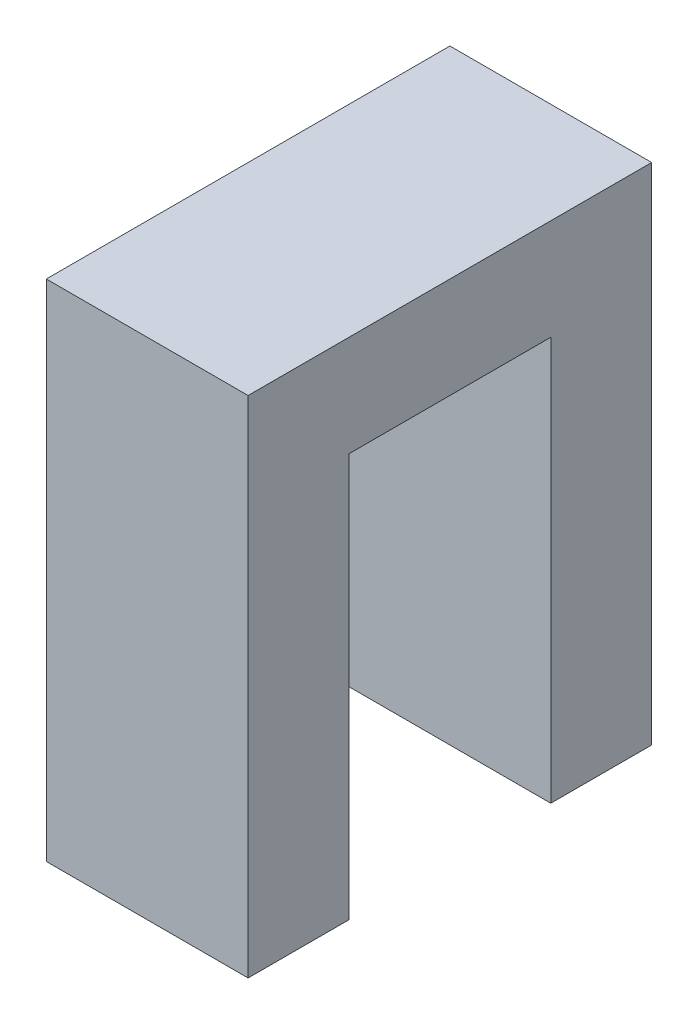
ISO-10303-21;
HEADER;
FILE_DESCRIPTION(('STEP AP214'),'2;1');
FILE_NAME('part.step','',(''),(''),'','','');
FILE_SCHEMA(('AUTOMOTIVE_DESIGN { 1 0 10303 214 1 1 1 1 }'));
ENDSEC;
DATA;
#1=APPLICATION_CONTEXT('core data for automotive mechanical design processes');
#2=APPLICATION_PROTOCOL_DEFINITION('international standard','automotive_design',2000,#1);
#3=PRODUCT_CONTEXT('',#1,'mechanical');
#4=PRODUCT('Part','Part','',(#3));
#5=PRODUCT_RELATED_PRODUCT_CATEGORY('part','',(#4));
#6=PRODUCT_DEFINITION_FORMATION('','',#4);
#7=PRODUCT_DEFINITION_CONTEXT('part definition',#1,'design');
#8=PRODUCT_DEFINITION('design','',#6,#7);
#9=PRODUCT_DEFINITION_SHAPE('','',#8);
#10=(LENGTH_UNIT() NAMED_UNIT(*) SI_UNIT(.MILLI.,.METRE.));
#11=(NAMED_UNIT(*) PLANE_ANGLE_UNIT() SI_UNIT($,.RADIAN.));
#12=(NAMED_UNIT(*) SI_UNIT($,.STERADIAN.) SOLID_ANGLE_UNIT());
#13=UNCERTAINTY_MEASURE_WITH_UNIT(LENGTH_MEASURE(1.E-05),#10,'distance_accuracy_value','');
#14=(GEOMETRIC_REPRESENTATION_CONTEXT(3) GLOBAL_UNCERTAINTY_ASSIGNED_CONTEXT((#13)) GLOBAL_UNIT_ASSIGNED_CONTEXT((#10,
#11,#12)) REPRESENTATION_CONTEXT('',''));
#15=CARTESIAN_POINT('',(0.,0.,0.));
#16=DIRECTION('',(0.,0.,1.));
#17=DIRECTION('',(1.,0.,0.));
#18=AXIS2_PLACEMENT_3D('',#15,#16,#17);
#19=CARTESIAN_POINT('',(-20.,-50.,40.));
#20=DIRECTION('',(0.,1.,0.));
#21=DIRECTION('',(0.,0.,1.));
#22=AXIS2_PLACEMENT_3D('',#19,#20,#21);
#23=PLANE('',#22);
#24=DIRECTION('',(0.,0.,-1.));
#25=VECTOR('',#24,1.);
#26=CARTESIAN_POINT('',(-20.,-50.,40.));
#27=LINE('',#26,#25);
#28=CARTESIAN_POINT('',(-20.,-50.,40.));
#29=VERTEX_POINT('',#28);
#30=CARTESIAN_POINT('',(-20.,-50.,20.));
#31=VERTEX_POINT('',#30);
#32=EDGE_CURVE('E125',#29,#31,#27,.T.);
#33=ORIENTED_EDGE('',*,*,#32,.T.);
#34=DIRECTION('',(1.,0.,0.));
#35=VECTOR('',#34,1.);
#36=CARTESIAN_POINT('',(-20.,-50.,20.));
#37=LINE('',#36,#35);
#38=CARTESIAN_POINT('',(20.,-50.,20.));
#39=VERTEX_POINT('',#38);
#40=EDGE_CURVE('E41',#31,#39,#37,.T.);
#41=ORIENTED_EDGE('',*,*,#40,.T.);
#42=DIRECTION('',(0.,0.,-1.));
#43=VECTOR('',#42,1.);
#44=CARTESIAN_POINT('',(20.,-50.,40.));
#45=LINE('',#44,#43);
#46=CARTESIAN_POINT('',(20.,-50.,40.));
#47=VERTEX_POINT('',#46);
#48=EDGE_CURVE('E122',#47,#39,#45,.T.);
#49=ORIENTED_EDGE('',*,*,#48,.F.);
#50=DIRECTION('',(1.,0.,0.));
#51=VECTOR('',#50,1.);
#52=CARTESIAN_POINT('',(-20.,-50.,40.));
#53=LINE('',#52,#51);
#54=EDGE_CURVE('E57',#29,#47,#53,.T.);
#55=ORIENTED_EDGE('',*,*,#54,.F.);
#56=EDGE_LOOP('',(#33,#41,#49,#55));
#57=FACE_BOUND('',#56,.T.);
#58=ADVANCED_FACE('F33',(#57),#23,.F.);
#59=CARTESIAN_POINT('',(20.,-50.,40.));
#60=DIRECTION('',(-1.,0.,0.));
#61=DIRECTION('',(0.,0.,1.));
#62=AXIS2_PLACEMENT_3D('',#59,#60,#61);
#63=PLANE('',#62);
#64=ORIENTED_EDGE('',*,*,#48,.T.);
#65=DIRECTION('',(0.,-1.,0.));
#66=VECTOR('',#65,1.);
#67=CARTESIAN_POINT('',(20.,-50.,20.));
#68=LINE('',#67,#66);
#69=CARTESIAN_POINT('',(20.,30.,20.));
#70=VERTEX_POINT('',#69);
#71=EDGE_CURVE('E109',#70,#39,#68,.T.);
#72=ORIENTED_EDGE('',*,*,#71,.F.);
#73=DIRECTION('',(0.,0.,1.));
#74=VECTOR('',#73,1.);
#75=CARTESIAN_POINT('',(20.,30.,20.));
#76=LINE('',#75,#74);
#77=CARTESIAN_POINT('',(20.,30.,-20.));
#78=VERTEX_POINT('',#77);
#79=EDGE_CURVE('E250',#78,#70,#76,.T.);
#80=ORIENTED_EDGE('',*,*,#79,.F.);
#81=DIRECTION('',(0.,1.,0.));
#82=VECTOR('',#81,1.);
#83=CARTESIAN_POINT('',(20.,-50.,-20.));
#84=LINE('',#83,#82);
#85=CARTESIAN_POINT('',(20.,-50.,-20.));
#86=VERTEX_POINT('',#85);
#87=EDGE_CURVE('E118',#86,#78,#84,.T.);
#88=ORIENTED_EDGE('',*,*,#87,.F.);
#89=CARTESIAN_POINT('',(20.,-50.,-40.));
#90=VERTEX_POINT('',#89);
#91=EDGE_CURVE('E79',#86,#90,#45,.T.);
#92=ORIENTED_EDGE('',*,*,#91,.T.);
#93=DIRECTION('',(0.,1.,0.));
#94=VECTOR('',#93,1.);
#95=CARTESIAN_POINT('',(20.,-50.,-40.));
#96=LINE('',#95,#94);
#97=CARTESIAN_POINT('',(20.,50.,-40.));
#98=VERTEX_POINT('',#97);
#99=EDGE_CURVE('E156',#90,#98,#96,.T.);
#100=ORIENTED_EDGE('',*,*,#99,.T.);
#101=DIRECTION('',(0.,0.,-1.));
#102=VECTOR('',#101,1.);
#103=CARTESIAN_POINT('',(20.,50.,40.));
#104=LINE('',#103,#102);
#105=CARTESIAN_POINT('',(20.,50.,40.));
#106=VERTEX_POINT('',#105);
#107=EDGE_CURVE('E139',#106,#98,#104,.T.);
#108=ORIENTED_EDGE('',*,*,#107,.F.);
#109=DIRECTION('',(0.,1.,0.));
#110=VECTOR('',#109,1.);
#111=CARTESIAN_POINT('',(20.,-50.,40.));
#112=LINE('',#111,#110);
#113=EDGE_CURVE('E128',#47,#106,#112,.T.);
#114=ORIENTED_EDGE('',*,*,#113,.F.);
#115=EDGE_LOOP('',(#64,#72,#80,#88,#92,#100,#108,#114));
#116=FACE_BOUND('',#115,.T.);
#117=ADVANCED_FACE('F35',(#116),#63,.F.);
#118=CARTESIAN_POINT('',(-20.,50.,40.));
#119=DIRECTION('',(0.,-1.,0.));
#120=DIRECTION('',(0.,0.,-1.));
#121=AXIS2_PLACEMENT_3D('',#118,#119,#120);
#122=PLANE('',#121);
#123=DIRECTION('',(-1.,0.,0.));
#124=VECTOR('',#123,1.);
#125=CARTESIAN_POINT('',(-20.,50.,-40.));
#126=LINE('',#125,#124);
#127=CARTESIAN_POINT('',(-20.,50.,-40.));
#128=VERTEX_POINT('',#127);
#129=EDGE_CURVE('E153',#98,#128,#126,.T.);
#130=ORIENTED_EDGE('',*,*,#129,.T.);
#131=DIRECTION('',(0.,0.,-1.));
#132=VECTOR('',#131,1.);
#133=CARTESIAN_POINT('',(-20.,50.,40.));
#134=LINE('',#133,#132);
#135=CARTESIAN_POINT('',(-20.,50.,40.));
#136=VERTEX_POINT('',#135);
#137=EDGE_CURVE('E136',#136,#128,#134,.T.);
#138=ORIENTED_EDGE('',*,*,#137,.F.);
#139=DIRECTION('',(-1.,0.,0.));
#140=VECTOR('',#139,1.);
#141=CARTESIAN_POINT('',(-20.,50.,40.));
#142=LINE('',#141,#140);
#143=EDGE_CURVE('E87',#106,#136,#142,.T.);
#144=ORIENTED_EDGE('',*,*,#143,.F.);
#145=ORIENTED_EDGE('',*,*,#107,.T.);
#146=EDGE_LOOP('',(#130,#138,#144,#145));
#147=FACE_BOUND('',#146,.T.);
#148=ADVANCED_FACE('F167',(#147),#122,.F.);
#149=CARTESIAN_POINT('',(-20.,-50.,40.));
#150=DIRECTION('',(1.,0.,0.));
#151=DIRECTION('',(0.,0.,-1.));
#152=AXIS2_PLACEMENT_3D('',#149,#150,#151);
#153=PLANE('',#152);
#154=DIRECTION('',(0.,0.,1.));
#155=VECTOR('',#154,1.);
#156=CARTESIAN_POINT('',(-20.,30.,40.));
#157=LINE('',#156,#155);
#158=CARTESIAN_POINT('',(-20.,30.,-20.));
#159=VERTEX_POINT('',#158);
#160=CARTESIAN_POINT('',(-20.,30.,20.));
#161=VERTEX_POINT('',#160);
#162=EDGE_CURVE('E11',#159,#161,#157,.T.);
#163=ORIENTED_EDGE('',*,*,#162,.T.);
#164=DIRECTION('',(0.,-1.,0.));
#165=VECTOR('',#164,1.);
#166=CARTESIAN_POINT('',(-20.,-50.,20.));
#167=LINE('',#166,#165);
#168=EDGE_CURVE('E161',#161,#31,#167,.T.);
#169=ORIENTED_EDGE('',*,*,#168,.T.);
#170=ORIENTED_EDGE('',*,*,#32,.F.);
#171=DIRECTION('',(0.,-1.,0.));
#172=VECTOR('',#171,1.);
#173=CARTESIAN_POINT('',(-20.,-50.,40.));
#174=LINE('',#173,#172);
#175=EDGE_CURVE('E158',#136,#29,#174,.T.);
#176=ORIENTED_EDGE('',*,*,#175,.F.);
#177=ORIENTED_EDGE('',*,*,#137,.T.);
#178=DIRECTION('',(0.,-1.,0.));
#179=VECTOR('',#178,1.);
#180=CARTESIAN_POINT('',(-20.,-50.,-40.));
#181=LINE('',#180,#179);
#182=CARTESIAN_POINT('',(-20.,-50.,-40.));
#183=VERTEX_POINT('',#182);
#184=EDGE_CURVE('E149',#128,#183,#181,.T.);
#185=ORIENTED_EDGE('',*,*,#184,.T.);
#186=CARTESIAN_POINT('',(-20.,-50.,-20.));
#187=VERTEX_POINT('',#186);
#188=EDGE_CURVE('E129',#187,#183,#27,.T.);
#189=ORIENTED_EDGE('',*,*,#188,.F.);
#190=DIRECTION('',(0.,1.,0.));
#191=VECTOR('',#190,1.);
#192=CARTESIAN_POINT('',(-20.,-50.,-20.));
#193=LINE('',#192,#191);
#194=EDGE_CURVE('E48',#187,#159,#193,.T.);
#195=ORIENTED_EDGE('',*,*,#194,.T.);
#196=EDGE_LOOP('',(#163,#169,#170,#176,#177,#185,#189,#195));
#197=FACE_BOUND('',#196,.T.);
#198=ADVANCED_FACE('F147',(#197),#153,.F.);
#199=ORIENTED_EDGE('',*,*,#91,.F.);
#200=DIRECTION('',(-1.,0.,0.));
#201=VECTOR('',#200,1.);
#202=CARTESIAN_POINT('',(-20.,-50.,-20.));
#203=LINE('',#202,#201);
#204=EDGE_CURVE('E126',#86,#187,#203,.T.);
#205=ORIENTED_EDGE('',*,*,#204,.T.);
#206=ORIENTED_EDGE('',*,*,#188,.T.);
#207=DIRECTION('',(1.,0.,0.));
#208=VECTOR('',#207,1.);
#209=CARTESIAN_POINT('',(-20.,-50.,-40.));
#210=LINE('',#209,#208);
#211=EDGE_CURVE('E133',#183,#90,#210,.T.);
#212=ORIENTED_EDGE('',*,*,#211,.T.);
#213=EDGE_LOOP('',(#199,#205,#206,#212));
#214=FACE_BOUND('',#213,.T.);
#215=ADVANCED_FACE('F143',(#214),#23,.F.);
#216=CARTESIAN_POINT('',(0.,0.,40.));
#217=DIRECTION('',(0.,0.,-1.));
#218=DIRECTION('',(-1.,0.,0.));
#219=AXIS2_PLACEMENT_3D('',#216,#217,#218);
#220=PLANE('',#219);
#221=ORIENTED_EDGE('',*,*,#113,.T.);
#222=ORIENTED_EDGE('',*,*,#143,.T.);
#223=ORIENTED_EDGE('',*,*,#175,.T.);
#224=ORIENTED_EDGE('',*,*,#54,.T.);
#225=EDGE_LOOP('',(#221,#222,#223,#224));
#226=FACE_BOUND('',#225,.T.);
#227=ADVANCED_FACE('F168',(#226),#220,.F.);
#228=CARTESIAN_POINT('',(0.,0.,-40.));
#229=DIRECTION('',(0.,0.,-1.));
#230=DIRECTION('',(-1.,0.,0.));
#231=AXIS2_PLACEMENT_3D('',#228,#229,#230);
#232=PLANE('',#231);
#233=ORIENTED_EDGE('',*,*,#99,.F.);
#234=ORIENTED_EDGE('',*,*,#211,.F.);
#235=ORIENTED_EDGE('',*,*,#184,.F.);
#236=ORIENTED_EDGE('',*,*,#129,.F.);
#237=EDGE_LOOP('',(#233,#234,#235,#236));
#238=FACE_BOUND('',#237,.T.);
#239=ADVANCED_FACE('F155',(#238),#232,.T.);
#240=CARTESIAN_POINT('',(-90.,30.,20.));
#241=DIRECTION('',(0.,1.,0.));
#242=DIRECTION('',(0.,0.,1.));
#243=AXIS2_PLACEMENT_3D('',#240,#241,#242);
#244=PLANE('',#243);
#245=DIRECTION('',(1.,0.,0.));
#246=VECTOR('',#245,1.);
#247=CARTESIAN_POINT('',(-90.,30.,-20.));
#248=LINE('',#247,#246);
#249=EDGE_CURVE('E249',#159,#78,#248,.T.);
#250=ORIENTED_EDGE('',*,*,#249,.T.);
#251=ORIENTED_EDGE('',*,*,#79,.T.);
#252=DIRECTION('',(1.,0.,0.));
#253=VECTOR('',#252,1.);
#254=CARTESIAN_POINT('',(-90.,30.,20.));
#255=LINE('',#254,#253);
#256=EDGE_CURVE('E114',#161,#70,#255,.T.);
#257=ORIENTED_EDGE('',*,*,#256,.F.);
#258=ORIENTED_EDGE('',*,*,#162,.F.);
#259=EDGE_LOOP('',(#250,#251,#257,#258));
#260=FACE_BOUND('',#259,.T.);
#261=ADVANCED_FACE('F175',(#260),#244,.F.);
#262=CARTESIAN_POINT('',(-90.,-50.,20.));
#263=DIRECTION('',(0.,0.,1.));
#264=DIRECTION('',(1.,0.,0.));
#265=AXIS2_PLACEMENT_3D('',#262,#263,#264);
#266=PLANE('',#265);
#267=ORIENTED_EDGE('',*,*,#256,.T.);
#268=ORIENTED_EDGE('',*,*,#71,.T.);
#269=ORIENTED_EDGE('',*,*,#40,.F.);
#270=ORIENTED_EDGE('',*,*,#168,.F.);
#271=EDGE_LOOP('',(#267,#268,#269,#270));
#272=FACE_BOUND('',#271,.T.);
#273=ADVANCED_FACE('F111',(#272),#266,.F.);
#274=CARTESIAN_POINT('',(-90.,-50.,-20.));
#275=DIRECTION('',(0.,0.,-1.));
#276=DIRECTION('',(-1.,0.,0.));
#277=AXIS2_PLACEMENT_3D('',#274,#275,#276);
#278=PLANE('',#277);
#279=ORIENTED_EDGE('',*,*,#204,.F.);
#280=ORIENTED_EDGE('',*,*,#87,.T.);
#281=ORIENTED_EDGE('',*,*,#249,.F.);
#282=ORIENTED_EDGE('',*,*,#194,.F.);
#283=EDGE_LOOP('',(#279,#280,#281,#282));
#284=FACE_BOUND('',#283,.T.);
#285=ADVANCED_FACE('F218',(#284),#278,.F.);
#286=CLOSED_SHELL('',(#58,#117,#148,#198,#215,#227,#239,#261,#273,#285));
#287=MANIFOLD_SOLID_BREP('B2',#286);
#288=ADVANCED_BREP_SHAPE_REPRESENTATION('',(#18,#287),#14);
#289=SHAPE_DEFINITION_REPRESENTATION(#9,#288);
ENDSEC;
END-ISO-10303-21;
